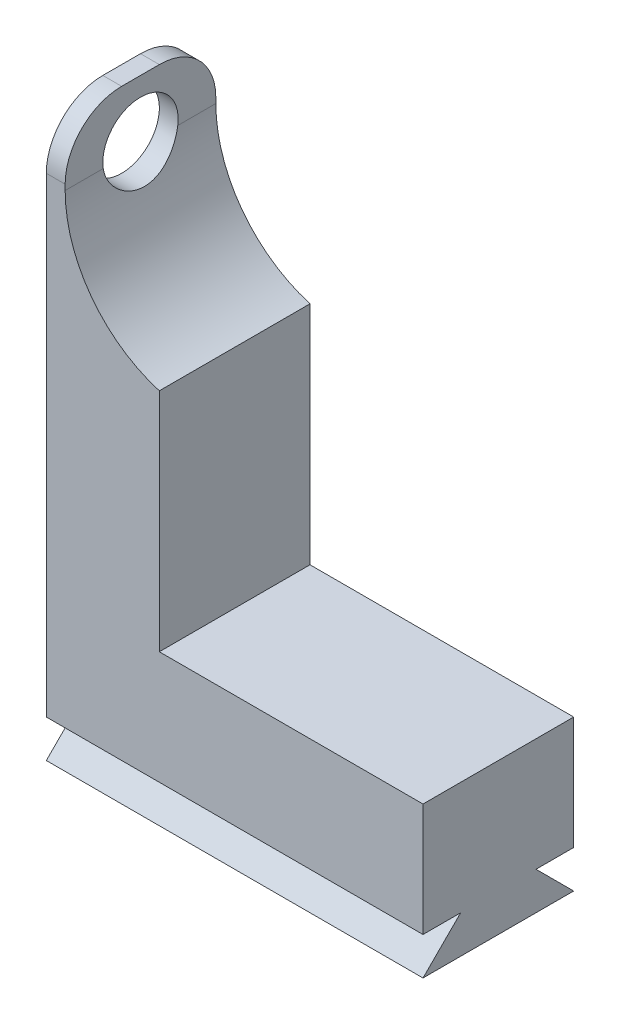
ISO-10303-21;
HEADER;
FILE_DESCRIPTION(('STEP AP214'),'2;1');
FILE_NAME('part.step','',(''),(''),'','','');
FILE_SCHEMA(('AUTOMOTIVE_DESIGN { 1 0 10303 214 1 1 1 1 }'));
ENDSEC;
DATA;
#1=APPLICATION_CONTEXT('core data for automotive mechanical design processes');
#2=APPLICATION_PROTOCOL_DEFINITION('international standard','automotive_design',2000,#1);
#3=PRODUCT_CONTEXT('',#1,'mechanical');
#4=PRODUCT('Part','Part','',(#3));
#5=PRODUCT_RELATED_PRODUCT_CATEGORY('part','',(#4));
#6=PRODUCT_DEFINITION_FORMATION('','',#4);
#7=PRODUCT_DEFINITION_CONTEXT('part definition',#1,'design');
#8=PRODUCT_DEFINITION('design','',#6,#7);
#9=PRODUCT_DEFINITION_SHAPE('','',#8);
#10=(LENGTH_UNIT() NAMED_UNIT(*) SI_UNIT(.MILLI.,.METRE.));
#11=(NAMED_UNIT(*) PLANE_ANGLE_UNIT() SI_UNIT($,.RADIAN.));
#12=(NAMED_UNIT(*) SI_UNIT($,.STERADIAN.) SOLID_ANGLE_UNIT());
#13=UNCERTAINTY_MEASURE_WITH_UNIT(LENGTH_MEASURE(1.E-05),#10,'distance_accuracy_value','');
#14=(GEOMETRIC_REPRESENTATION_CONTEXT(3) GLOBAL_UNCERTAINTY_ASSIGNED_CONTEXT((#13)) GLOBAL_UNIT_ASSIGNED_CONTEXT((#10,
#11,#12)) REPRESENTATION_CONTEXT('',''));
#15=CARTESIAN_POINT('',(0.,0.,0.));
#16=DIRECTION('',(0.,0.,1.));
#17=DIRECTION('',(1.,0.,0.));
#18=AXIS2_PLACEMENT_3D('',#15,#16,#17);
#19=CARTESIAN_POINT('',(6.,0.,0.));
#20=DIRECTION('',(-1.,0.,0.));
#21=DIRECTION('',(0.,0.,1.));
#22=AXIS2_PLACEMENT_3D('',#19,#20,#21);
#23=PLANE('',#22);
#24=DIRECTION('',(0.,0.,1.));
#25=VECTOR('',#24,1.);
#26=CARTESIAN_POINT('',(6.,-7.,-4.));
#27=LINE('',#26,#25);
#28=CARTESIAN_POINT('',(6.,-7.,-4.));
#29=VERTEX_POINT('',#28);
#30=CARTESIAN_POINT('',(6.,-7.,4.));
#31=VERTEX_POINT('',#30);
#32=EDGE_CURVE('E176',#29,#31,#27,.T.);
#33=ORIENTED_EDGE('',*,*,#32,.F.);
#34=DIRECTION('',(0.,1.,0.));
#35=VECTOR('',#34,1.);
#36=CARTESIAN_POINT('',(6.,-15.,-4.));
#37=LINE('',#36,#35);
#38=CARTESIAN_POINT('',(6.,5.,-4.));
#39=VERTEX_POINT('',#38);
#40=EDGE_CURVE('E200',#29,#39,#37,.T.);
#41=ORIENTED_EDGE('',*,*,#40,.T.);
#42=DIRECTION('',(0.,0.,-1.));
#43=VECTOR('',#42,1.);
#44=CARTESIAN_POINT('',(6.,5.,-4.));
#45=LINE('',#44,#43);
#46=CARTESIAN_POINT('',(6.,5.,4.));
#47=VERTEX_POINT('',#46);
#48=EDGE_CURVE('E188',#47,#39,#45,.T.);
#49=ORIENTED_EDGE('',*,*,#48,.F.);
#50=DIRECTION('',(0.,-1.,0.));
#51=VECTOR('',#50,1.);
#52=CARTESIAN_POINT('',(6.,-15.,4.));
#53=LINE('',#52,#51);
#54=EDGE_CURVE('E202',#47,#31,#53,.T.);
#55=ORIENTED_EDGE('',*,*,#54,.T.);
#56=EDGE_LOOP('',(#33,#41,#49,#55));
#57=FACE_BOUND('',#56,.T.);
#58=ADVANCED_FACE('F36',(#57),#23,.F.);
#59=CARTESIAN_POINT('',(6.,-15.,-4.));
#60=DIRECTION('',(0.,0.,1.));
#61=DIRECTION('',(1.,0.,0.));
#62=AXIS2_PLACEMENT_3D('',#59,#60,#61);
#63=PLANE('',#62);
#64=DIRECTION('',(0.,1.,0.));
#65=VECTOR('',#64,1.);
#66=CARTESIAN_POINT('',(20.,-15.,-4.));
#67=LINE('',#66,#65);
#68=CARTESIAN_POINT('',(20.,-13.,-4.));
#69=VERTEX_POINT('',#68);
#70=CARTESIAN_POINT('',(20.,-7.,-4.));
#71=VERTEX_POINT('',#70);
#72=EDGE_CURVE('E178',#69,#71,#67,.T.);
#73=ORIENTED_EDGE('',*,*,#72,.F.);
#74=DIRECTION('',(-1.,0.,0.));
#75=VECTOR('',#74,1.);
#76=CARTESIAN_POINT('',(20.001,-13.,-4.));
#77=LINE('',#76,#75);
#78=CARTESIAN_POINT('',(0.,-13.,-4.));
#79=VERTEX_POINT('',#78);
#80=EDGE_CURVE('E60',#69,#79,#77,.T.);
#81=ORIENTED_EDGE('',*,*,#80,.T.);
#82=DIRECTION('',(0.,1.,0.));
#83=VECTOR('',#82,1.);
#84=CARTESIAN_POINT('',(0.,-15.,-4.));
#85=LINE('',#84,#83);
#86=CARTESIAN_POINT('',(0.,12.,-4.));
#87=VERTEX_POINT('',#86);
#88=EDGE_CURVE('E197',#79,#87,#85,.T.);
#89=ORIENTED_EDGE('',*,*,#88,.T.);
#90=DIRECTION('',(-1.,0.,0.));
#91=VECTOR('',#90,1.);
#92=CARTESIAN_POINT('',(6.,12.,-4.));
#93=LINE('',#92,#91);
#94=CARTESIAN_POINT('',(1.,12.,-4.));
#95=VERTEX_POINT('',#94);
#96=EDGE_CURVE('E223',#87,#95,#93,.F.);
#97=ORIENTED_EDGE('',*,*,#96,.T.);
#98=DIRECTION('',(0.,1.,0.));
#99=VECTOR('',#98,1.);
#100=CARTESIAN_POINT('',(1.,15.,-4.));
#101=LINE('',#100,#99);
#102=CARTESIAN_POINT('',(1.,11.7082039324994,-4.));
#103=VERTEX_POINT('',#102);
#104=EDGE_CURVE('E189',#103,#95,#101,.T.);
#105=ORIENTED_EDGE('',*,*,#104,.F.);
#106=CARTESIAN_POINT('',(8.,11.7082039324994,-4.));
#107=DIRECTION('',(0.,0.,1.));
#108=DIRECTION('',(1.,0.,0.));
#109=AXIS2_PLACEMENT_3D('',#106,#107,#108);
#110=CIRCLE('',#109,7.);
#111=EDGE_CURVE('E45',#103,#39,#110,.T.);
#112=ORIENTED_EDGE('',*,*,#111,.T.);
#113=ORIENTED_EDGE('',*,*,#40,.F.);
#114=DIRECTION('',(-1.,0.,0.));
#115=VECTOR('',#114,1.);
#116=CARTESIAN_POINT('',(20.,-7.,-4.));
#117=LINE('',#116,#115);
#118=EDGE_CURVE('E170',#71,#29,#117,.T.);
#119=ORIENTED_EDGE('',*,*,#118,.F.);
#120=EDGE_LOOP('',(#73,#81,#89,#97,#105,#112,#113,#119));
#121=FACE_BOUND('',#120,.T.);
#122=ADVANCED_FACE('F260',(#121),#63,.F.);
#123=CARTESIAN_POINT('',(6.,15.,4.));
#124=DIRECTION('',(0.,-1.,0.));
#125=DIRECTION('',(0.,0.,-1.));
#126=AXIS2_PLACEMENT_3D('',#123,#124,#125);
#127=PLANE('',#126);
#128=DIRECTION('',(0.,0.,1.));
#129=VECTOR('',#128,1.);
#130=CARTESIAN_POINT('',(1.,15.,-4.));
#131=LINE('',#130,#129);
#132=CARTESIAN_POINT('',(1.,15.,-0.999999999999997));
#133=VERTEX_POINT('',#132);
#134=CARTESIAN_POINT('',(1.,15.,1.));
#135=VERTEX_POINT('',#134);
#136=EDGE_CURVE('E191',#133,#135,#131,.T.);
#137=ORIENTED_EDGE('',*,*,#136,.F.);
#138=DIRECTION('',(-1.,0.,0.));
#139=VECTOR('',#138,1.);
#140=CARTESIAN_POINT('',(6.,15.,-0.999999999999997));
#141=LINE('',#140,#139);
#142=CARTESIAN_POINT('',(0.,15.,-0.999999999999997));
#143=VERTEX_POINT('',#142);
#144=EDGE_CURVE('E215',#133,#143,#141,.T.);
#145=ORIENTED_EDGE('',*,*,#144,.T.);
#146=DIRECTION('',(0.,0.,1.));
#147=VECTOR('',#146,1.);
#148=CARTESIAN_POINT('',(0.,15.,4.));
#149=LINE('',#148,#147);
#150=CARTESIAN_POINT('',(0.,15.,1.));
#151=VERTEX_POINT('',#150);
#152=EDGE_CURVE('E206',#143,#151,#149,.T.);
#153=ORIENTED_EDGE('',*,*,#152,.T.);
#154=DIRECTION('',(-1.,0.,0.));
#155=VECTOR('',#154,1.);
#156=CARTESIAN_POINT('',(6.,15.,1.));
#157=LINE('',#156,#155);
#158=EDGE_CURVE('E153',#151,#135,#157,.F.);
#159=ORIENTED_EDGE('',*,*,#158,.T.);
#160=EDGE_LOOP('',(#137,#145,#153,#159));
#161=FACE_BOUND('',#160,.T.);
#162=ADVANCED_FACE('F270',(#161),#127,.F.);
#163=CARTESIAN_POINT('',(6.,-15.,4.));
#164=DIRECTION('',(0.,0.,-1.));
#165=DIRECTION('',(-1.,0.,0.));
#166=AXIS2_PLACEMENT_3D('',#163,#164,#165);
#167=PLANE('',#166);
#168=DIRECTION('',(0.,-1.,0.));
#169=VECTOR('',#168,1.);
#170=CARTESIAN_POINT('',(0.,-15.,4.));
#171=LINE('',#170,#169);
#172=CARTESIAN_POINT('',(0.,12.,4.));
#173=VERTEX_POINT('',#172);
#174=CARTESIAN_POINT('',(0.,-13.,4.));
#175=VERTEX_POINT('',#174);
#176=EDGE_CURVE('E209',#173,#175,#171,.T.);
#177=ORIENTED_EDGE('',*,*,#176,.T.);
#178=DIRECTION('',(-1.,0.,0.));
#179=VECTOR('',#178,1.);
#180=CARTESIAN_POINT('',(20.001,-13.,4.));
#181=LINE('',#180,#179);
#182=CARTESIAN_POINT('',(20.,-13.,4.));
#183=VERTEX_POINT('',#182);
#184=EDGE_CURVE('E316',#183,#175,#181,.T.);
#185=ORIENTED_EDGE('',*,*,#184,.F.);
#186=DIRECTION('',(0.,-1.,0.));
#187=VECTOR('',#186,1.);
#188=CARTESIAN_POINT('',(20.,-15.,4.));
#189=LINE('',#188,#187);
#190=CARTESIAN_POINT('',(20.,-7.,4.));
#191=VERTEX_POINT('',#190);
#192=EDGE_CURVE('E167',#191,#183,#189,.T.);
#193=ORIENTED_EDGE('',*,*,#192,.F.);
#194=DIRECTION('',(-1.,0.,0.));
#195=VECTOR('',#194,1.);
#196=CARTESIAN_POINT('',(20.,-7.,4.));
#197=LINE('',#196,#195);
#198=EDGE_CURVE('E166',#191,#31,#197,.T.);
#199=ORIENTED_EDGE('',*,*,#198,.T.);
#200=ORIENTED_EDGE('',*,*,#54,.F.);
#201=CARTESIAN_POINT('',(8.,11.7082039324994,4.));
#202=DIRECTION('',(0.,0.,-1.));
#203=DIRECTION('',(-1.,0.,0.));
#204=AXIS2_PLACEMENT_3D('',#201,#202,#203);
#205=CIRCLE('',#204,7.);
#206=CARTESIAN_POINT('',(1.,11.7082039324994,4.));
#207=VERTEX_POINT('',#206);
#208=EDGE_CURVE('E11',#47,#207,#205,.T.);
#209=ORIENTED_EDGE('',*,*,#208,.T.);
#210=DIRECTION('',(0.,-1.,0.));
#211=VECTOR('',#210,1.);
#212=CARTESIAN_POINT('',(1.,15.,4.));
#213=LINE('',#212,#211);
#214=CARTESIAN_POINT('',(1.,12.,4.));
#215=VERTEX_POINT('',#214);
#216=EDGE_CURVE('E194',#215,#207,#213,.T.);
#217=ORIENTED_EDGE('',*,*,#216,.F.);
#218=DIRECTION('',(-1.,0.,0.));
#219=VECTOR('',#218,1.);
#220=CARTESIAN_POINT('',(6.,12.,4.));
#221=LINE('',#220,#219);
#222=EDGE_CURVE('E230',#215,#173,#221,.T.);
#223=ORIENTED_EDGE('',*,*,#222,.T.);
#224=EDGE_LOOP('',(#177,#185,#193,#199,#200,#209,#217,#223));
#225=FACE_BOUND('',#224,.T.);
#226=ADVANCED_FACE('F267',(#225),#167,.F.);
#227=CARTESIAN_POINT('',(6.,-15.,4.));
#228=DIRECTION('',(0.,1.,0.));
#229=DIRECTION('',(0.,0.,1.));
#230=AXIS2_PLACEMENT_3D('',#227,#228,#229);
#231=PLANE('',#230);
#232=DIRECTION('',(0.,0.,-1.));
#233=VECTOR('',#232,1.);
#234=CARTESIAN_POINT('',(0.,-15.,4.));
#235=LINE('',#234,#233);
#236=CARTESIAN_POINT('',(0.,-15.,4.));
#237=VERTEX_POINT('',#236);
#238=CARTESIAN_POINT('',(0.,-15.,-4.));
#239=VERTEX_POINT('',#238);
#240=EDGE_CURVE('E203',#237,#239,#235,.T.);
#241=ORIENTED_EDGE('',*,*,#240,.T.);
#242=DIRECTION('',(-1.,0.,0.));
#243=VECTOR('',#242,1.);
#244=CARTESIAN_POINT('',(6.,-15.,-4.));
#245=LINE('',#244,#243);
#246=CARTESIAN_POINT('',(20.,-15.,-4.));
#247=VERTEX_POINT('',#246);
#248=EDGE_CURVE('E154',#247,#239,#245,.T.);
#249=ORIENTED_EDGE('',*,*,#248,.F.);
#250=DIRECTION('',(0.,0.,-1.));
#251=VECTOR('',#250,1.);
#252=CARTESIAN_POINT('',(20.,-15.,-4.));
#253=LINE('',#252,#251);
#254=CARTESIAN_POINT('',(20.,-15.,4.));
#255=VERTEX_POINT('',#254);
#256=EDGE_CURVE('E160',#255,#247,#253,.T.);
#257=ORIENTED_EDGE('',*,*,#256,.F.);
#258=DIRECTION('',(-1.,0.,0.));
#259=VECTOR('',#258,1.);
#260=CARTESIAN_POINT('',(6.,-15.,4.));
#261=LINE('',#260,#259);
#262=EDGE_CURVE('E142',#255,#237,#261,.T.);
#263=ORIENTED_EDGE('',*,*,#262,.T.);
#264=EDGE_LOOP('',(#241,#249,#257,#263));
#265=FACE_BOUND('',#264,.T.);
#266=ADVANCED_FACE('F165',(#265),#231,.F.);
#267=CARTESIAN_POINT('',(0.,0.,0.));
#268=DIRECTION('',(-1.,0.,0.));
#269=DIRECTION('',(0.,0.,1.));
#270=AXIS2_PLACEMENT_3D('',#267,#268,#269);
#271=PLANE('',#270);
#272=DIRECTION('',(0.,-0.707106781186548,0.707106781186548));
#273=VECTOR('',#272,1.);
#274=CARTESIAN_POINT('',(0.,-13.,2.));
#275=LINE('',#274,#273);
#276=CARTESIAN_POINT('',(0.,-13.,2.));
#277=VERTEX_POINT('',#276);
#278=EDGE_CURVE('E148',#277,#237,#275,.T.);
#279=ORIENTED_EDGE('',*,*,#278,.F.);
#280=DIRECTION('',(0.,0.,-1.));
#281=VECTOR('',#280,1.);
#282=CARTESIAN_POINT('',(0.,-13.,4.));
#283=LINE('',#282,#281);
#284=EDGE_CURVE('E313',#175,#277,#283,.T.);
#285=ORIENTED_EDGE('',*,*,#284,.F.);
#286=ORIENTED_EDGE('',*,*,#176,.F.);
#287=CARTESIAN_POINT('',(0.,12.,1.));
#288=DIRECTION('',(-1.,0.,0.));
#289=DIRECTION('',(0.,0.,1.));
#290=AXIS2_PLACEMENT_3D('',#287,#288,#289);
#291=CIRCLE('',#290,3.);
#292=EDGE_CURVE('E218',#173,#151,#291,.T.);
#293=ORIENTED_EDGE('',*,*,#292,.T.);
#294=ORIENTED_EDGE('',*,*,#152,.F.);
#295=CARTESIAN_POINT('',(0.,12.,-0.999999999999997));
#296=DIRECTION('',(-1.,0.,0.));
#297=DIRECTION('',(0.,0.,1.));
#298=AXIS2_PLACEMENT_3D('',#295,#296,#297);
#299=CIRCLE('',#298,3.);
#300=EDGE_CURVE('E220',#143,#87,#299,.T.);
#301=ORIENTED_EDGE('',*,*,#300,.T.);
#302=ORIENTED_EDGE('',*,*,#88,.F.);
#303=DIRECTION('',(0.,0.,-1.));
#304=VECTOR('',#303,1.);
#305=CARTESIAN_POINT('',(0.,-13.,-4.));
#306=LINE('',#305,#304);
#307=CARTESIAN_POINT('',(0.,-13.,-2.));
#308=VERTEX_POINT('',#307);
#309=EDGE_CURVE('E327',#308,#79,#306,.T.);
#310=ORIENTED_EDGE('',*,*,#309,.F.);
#311=DIRECTION('',(0.,0.707106781186548,0.707106781186548));
#312=VECTOR('',#311,1.);
#313=CARTESIAN_POINT('',(0.,-13.,-2.));
#314=LINE('',#313,#312);
#315=EDGE_CURVE('E330',#239,#308,#314,.T.);
#316=ORIENTED_EDGE('',*,*,#315,.F.);
#317=ORIENTED_EDGE('',*,*,#240,.F.);
#318=EDGE_LOOP('',(#279,#285,#286,#293,#294,#301,#302,#310,#316,#317));
#319=FACE_BOUND('',#318,.T.);
#320=CARTESIAN_POINT('',(0.,12.,0.));
#321=DIRECTION('',(-1.,0.,0.));
#322=DIRECTION('',(0.,0.,1.));
#323=AXIS2_PLACEMENT_3D('',#320,#321,#322);
#324=CIRCLE('',#323,2.);
#325=CARTESIAN_POINT('',(0.,12.,2.));
#326=VERTEX_POINT('',#325);
#327=EDGE_CURVE('E182',#326,#326,#324,.T.);
#328=ORIENTED_EDGE('',*,*,#327,.F.);
#329=EDGE_LOOP('',(#328));
#330=FACE_BOUND('',#329,.T.);
#331=ADVANCED_FACE('F256',(#319,#330),#271,.T.);
#332=CARTESIAN_POINT('',(1.,0.,0.));
#333=DIRECTION('',(-1.,0.,0.));
#334=DIRECTION('',(0.,0.,1.));
#335=AXIS2_PLACEMENT_3D('',#332,#333,#334);
#336=PLANE('',#335);
#337=ORIENTED_EDGE('',*,*,#216,.T.);
#338=DIRECTION('',(0.,0.,-1.));
#339=VECTOR('',#338,1.);
#340=CARTESIAN_POINT('',(1.,11.7082039324994,0.));
#341=LINE('',#340,#339);
#342=CARTESIAN_POINT('',(1.,11.7082039324994,1.97859926589271));
#343=VERTEX_POINT('',#342);
#344=EDGE_CURVE('E235',#207,#343,#341,.T.);
#345=ORIENTED_EDGE('',*,*,#344,.T.);
#346=CARTESIAN_POINT('',(1.,12.,0.));
#347=DIRECTION('',(-1.,0.,0.));
#348=DIRECTION('',(0.,0.,1.));
#349=AXIS2_PLACEMENT_3D('',#346,#347,#348);
#350=CIRCLE('',#349,2.);
#351=CARTESIAN_POINT('',(1.,11.7082039324994,-1.97859926589271));
#352=VERTEX_POINT('',#351);
#353=EDGE_CURVE('E185',#352,#343,#350,.F.);
#354=ORIENTED_EDGE('',*,*,#353,.F.);
#355=DIRECTION('',(0.,0.,-1.));
#356=VECTOR('',#355,1.);
#357=CARTESIAN_POINT('',(1.,11.7082039324994,0.));
#358=LINE('',#357,#356);
#359=EDGE_CURVE('E233',#352,#103,#358,.T.);
#360=ORIENTED_EDGE('',*,*,#359,.T.);
#361=ORIENTED_EDGE('',*,*,#104,.T.);
#362=CARTESIAN_POINT('',(1.,12.,-0.999999999999997));
#363=DIRECTION('',(-1.,0.,0.));
#364=DIRECTION('',(0.,0.,1.));
#365=AXIS2_PLACEMENT_3D('',#362,#363,#364);
#366=CIRCLE('',#365,3.);
#367=EDGE_CURVE('E228',#95,#133,#366,.F.);
#368=ORIENTED_EDGE('',*,*,#367,.T.);
#369=ORIENTED_EDGE('',*,*,#136,.T.);
#370=CARTESIAN_POINT('',(1.,12.,1.));
#371=DIRECTION('',(-1.,0.,0.));
#372=DIRECTION('',(0.,0.,1.));
#373=AXIS2_PLACEMENT_3D('',#370,#371,#372);
#374=CIRCLE('',#373,3.);
#375=EDGE_CURVE('E226',#135,#215,#374,.F.);
#376=ORIENTED_EDGE('',*,*,#375,.T.);
#377=EDGE_LOOP('',(#337,#345,#354,#360,#361,#368,#369,#376));
#378=FACE_BOUND('',#377,.T.);
#379=ADVANCED_FACE('F250',(#378),#336,.F.);
#380=CARTESIAN_POINT('',(6.001,12.,0.));
#381=DIRECTION('',(-1.,0.,0.));
#382=DIRECTION('',(0.,0.,1.));
#383=AXIS2_PLACEMENT_3D('',#380,#381,#382);
#384=CYLINDRICAL_SURFACE('',#383,2.);
#385=ORIENTED_EDGE('',*,*,#327,.T.);
#386=EDGE_LOOP('',(#385));
#387=FACE_BOUND('',#386,.T.);
#388=ORIENTED_EDGE('',*,*,#353,.T.);
#389=CARTESIAN_POINT('',(1.,11.7082039324994,1.97859926589271));
#390=CARTESIAN_POINT('',(0.999996562860208,11.6534103102538,1.97051932659087));
#391=CARTESIAN_POINT('',(1.00064404270127,11.5989809996655,1.96016445126653));
#392=CARTESIAN_POINT('',(1.00315721427137,11.49120493273,1.93499130449663));
#393=CARTESIAN_POINT('',(1.00502264953323,11.4378579509127,1.92017397307266));
#394=CARTESIAN_POINT('',(1.01230680676171,11.2802425839352,1.86925021813744));
#395=CARTESIAN_POINT('',(1.0194143490975,11.1780774920176,1.8266240393413));
#396=CARTESIAN_POINT('',(1.03702704684094,10.9824747134704,1.72533764417593));
#397=CARTESIAN_POINT('',(1.0475313195301,10.8890347675325,1.66668159414998));
#398=CARTESIAN_POINT('',(1.07051537194149,10.7131591235795,1.53496264942972));
#399=CARTESIAN_POINT('',(1.08299578583143,10.6307269738072,1.46189512806379));
#400=CARTESIAN_POINT('',(1.10861741912857,10.4773357089019,1.30156361481695));
#401=CARTESIAN_POINT('',(1.1217670864165,10.406662543328,1.21402731013548));
#402=CARTESIAN_POINT('',(1.14676062553112,10.2808868048644,1.02821948254142));
#403=CARTESIAN_POINT('',(1.15860439493489,10.2257854527592,0.929947118790279));
#404=CARTESIAN_POINT('',(1.17948806740025,10.1324722060938,0.724656504967221));
#405=CARTESIAN_POINT('',(1.18851038586016,10.0943656276487,0.617588458544428));
#406=CARTESIAN_POINT('',(1.20240758381608,10.0367893877439,0.398304492566966));
#407=CARTESIAN_POINT('',(1.20728348602075,10.0173151304958,0.286089849615024));
#408=CARTESIAN_POINT('',(1.21213818189386,9.99793230877699,0.0628453308607681));
#409=CARTESIAN_POINT('',(1.21224180665944,9.99752499501717,-0.0481386847254634));
#410=CARTESIAN_POINT('',(1.20785408072726,10.0150314718204,-0.268553705349644));
#411=CARTESIAN_POINT('',(1.20336291948162,10.0329445069992,-0.377984774230044));
#412=CARTESIAN_POINT('',(1.19046580159736,10.0861760662486,-0.590919969243101));
#413=CARTESIAN_POINT('',(1.18210561885863,10.1212913496116,-0.694477918393925));
#414=CARTESIAN_POINT('',(1.162556299992,10.2077645910928,-0.894285662048947));
#415=CARTESIAN_POINT('',(1.15136677722658,10.2591247693636,-0.990534455396505));
#416=CARTESIAN_POINT('',(1.12726800273844,10.3780497571907,-1.1754321377698));
#417=CARTESIAN_POINT('',(1.11432474137647,10.445964420414,-1.26385154889354));
#418=CARTESIAN_POINT('',(1.08857868933361,10.5955484465296,-1.42823943841375));
#419=CARTESIAN_POINT('',(1.07577593952752,10.6772217044483,-1.5042043789277));
#420=CARTESIAN_POINT('',(1.05175529370202,10.8538181020398,-1.64289585425982));
#421=CARTESIAN_POINT('',(1.04057083092641,10.9489570763649,-1.70535357166439));
#422=CARTESIAN_POINT('',(1.02168130333407,11.148669330584,-1.81330736430922));
#423=CARTESIAN_POINT('',(1.01397215975283,11.253231377278,-1.85882331204387));
#424=CARTESIAN_POINT('',(1.00581287837113,11.4174018870769,-1.91419633667263));
#425=CARTESIAN_POINT('',(1.00365410487768,11.4747579839976,-1.93071995661781));
#426=CARTESIAN_POINT('',(1.00074609083548,11.5906711104765,-1.95857011123507));
#427=CARTESIAN_POINT('',(0.999994957876539,11.6492264205451,-1.96990360790725));
#428=CARTESIAN_POINT('',(1.,11.7082039324994,-1.97859926589271));
#429=B_SPLINE_CURVE_WITH_KNOTS('',3,(#389,#390,#391,#392,#393,#394,#395,#396,#397,#398,#399,
#400,#401,#402,#403,#404,#405,#406,#407,#408,#409,#410,#411,#412,#413,#414,#415,#416,#417,#418,
#419,#420,#421,#422,#423,#424,#425,#426,#427,#428),.UNSPECIFIED.,.F.,.F.,(4,2,2,2,2,2,2,2,2,2,2,
2,2,2,2,2,2,2,2,4),(0.,0.166051375892929,0.332067797305901,0.66313594191583,0.994118119905654,
1.32520673017662,1.66343964047296,2.00169905988474,2.34202648622498,2.6822699468417,
3.01360827437928,3.34493294073255,3.67243419745032,3.99998023237168,4.33516209061209,
4.67043899802242,5.01187479596643,5.35290882213419,5.53186702270183,5.71058446155445),.UNSPECIFIED.);
#430=EDGE_CURVE('E238',#343,#352,#429,.T.);
#431=ORIENTED_EDGE('',*,*,#430,.T.);
#432=EDGE_LOOP('',(#388,#431));
#433=FACE_BOUND('',#432,.T.);
#434=ADVANCED_FACE('F244',(#387,#433),#384,.F.);
#435=CARTESIAN_POINT('',(6.,12.,-0.999999999999997));
#436=DIRECTION('',(-1.,0.,0.));
#437=DIRECTION('',(0.,0.,1.));
#438=AXIS2_PLACEMENT_3D('',#435,#436,#437);
#439=CYLINDRICAL_SURFACE('',#438,3.);
#440=ORIENTED_EDGE('',*,*,#367,.F.);
#441=ORIENTED_EDGE('',*,*,#96,.F.);
#442=ORIENTED_EDGE('',*,*,#300,.F.);
#443=ORIENTED_EDGE('',*,*,#144,.F.);
#444=EDGE_LOOP('',(#440,#441,#442,#443));
#445=FACE_BOUND('',#444,.T.);
#446=ADVANCED_FACE('F249',(#445),#439,.T.);
#447=CARTESIAN_POINT('',(6.,12.,1.));
#448=DIRECTION('',(-1.,0.,0.));
#449=DIRECTION('',(0.,0.,1.));
#450=AXIS2_PLACEMENT_3D('',#447,#448,#449);
#451=CYLINDRICAL_SURFACE('',#450,3.);
#452=ORIENTED_EDGE('',*,*,#375,.F.);
#453=ORIENTED_EDGE('',*,*,#158,.F.);
#454=ORIENTED_EDGE('',*,*,#292,.F.);
#455=ORIENTED_EDGE('',*,*,#222,.F.);
#456=EDGE_LOOP('',(#452,#453,#454,#455));
#457=FACE_BOUND('',#456,.T.);
#458=ADVANCED_FACE('F279',(#457),#451,.T.);
#459=CARTESIAN_POINT('',(8.,11.7082039324994,-4.));
#460=DIRECTION('',(0.,0.,-1.));
#461=DIRECTION('',(0.,1.,0.));
#462=AXIS2_PLACEMENT_3D('',#459,#460,#461);
#463=CYLINDRICAL_SURFACE('',#462,7.);
#464=ORIENTED_EDGE('',*,*,#208,.F.);
#465=ORIENTED_EDGE('',*,*,#48,.T.);
#466=ORIENTED_EDGE('',*,*,#111,.F.);
#467=ORIENTED_EDGE('',*,*,#359,.F.);
#468=ORIENTED_EDGE('',*,*,#430,.F.);
#469=ORIENTED_EDGE('',*,*,#344,.F.);
#470=EDGE_LOOP('',(#464,#465,#466,#467,#468,#469));
#471=FACE_BOUND('',#470,.T.);
#472=ADVANCED_FACE('F38',(#471),#463,.F.);
#473=CARTESIAN_POINT('',(20.,-7.,-4.));
#474=DIRECTION('',(0.,-1.,0.));
#475=DIRECTION('',(0.,0.,-1.));
#476=AXIS2_PLACEMENT_3D('',#473,#474,#475);
#477=PLANE('',#476);
#478=ORIENTED_EDGE('',*,*,#32,.T.);
#479=ORIENTED_EDGE('',*,*,#198,.F.);
#480=DIRECTION('',(0.,0.,1.));
#481=VECTOR('',#480,1.);
#482=CARTESIAN_POINT('',(20.,-7.,-4.));
#483=LINE('',#482,#481);
#484=EDGE_CURVE('E172',#71,#191,#483,.T.);
#485=ORIENTED_EDGE('',*,*,#484,.F.);
#486=ORIENTED_EDGE('',*,*,#118,.T.);
#487=EDGE_LOOP('',(#478,#479,#485,#486));
#488=FACE_BOUND('',#487,.T.);
#489=ADVANCED_FACE('F252',(#488),#477,.F.);
#490=CARTESIAN_POINT('',(20.,0.,0.));
#491=DIRECTION('',(1.,0.,0.));
#492=DIRECTION('',(0.,0.,-1.));
#493=AXIS2_PLACEMENT_3D('',#490,#491,#492);
#494=PLANE('',#493);
#495=DIRECTION('',(0.,-0.707106781186548,0.707106781186548));
#496=VECTOR('',#495,1.);
#497=CARTESIAN_POINT('',(20.,-13.,2.));
#498=LINE('',#497,#496);
#499=CARTESIAN_POINT('',(20.,-13.,2.));
#500=VERTEX_POINT('',#499);
#501=EDGE_CURVE('E145',#500,#255,#498,.T.);
#502=ORIENTED_EDGE('',*,*,#501,.T.);
#503=ORIENTED_EDGE('',*,*,#256,.T.);
#504=DIRECTION('',(0.,0.707106781186548,0.707106781186548));
#505=VECTOR('',#504,1.);
#506=CARTESIAN_POINT('',(20.,-13.,-2.));
#507=LINE('',#506,#505);
#508=CARTESIAN_POINT('',(20.,-13.,-2.));
#509=VERTEX_POINT('',#508);
#510=EDGE_CURVE('E333',#247,#509,#507,.T.);
#511=ORIENTED_EDGE('',*,*,#510,.T.);
#512=DIRECTION('',(0.,0.,-1.));
#513=VECTOR('',#512,1.);
#514=CARTESIAN_POINT('',(20.,-13.,-4.));
#515=LINE('',#514,#513);
#516=EDGE_CURVE('E323',#509,#69,#515,.T.);
#517=ORIENTED_EDGE('',*,*,#516,.T.);
#518=ORIENTED_EDGE('',*,*,#72,.T.);
#519=ORIENTED_EDGE('',*,*,#484,.T.);
#520=ORIENTED_EDGE('',*,*,#192,.T.);
#521=DIRECTION('',(0.,0.,-1.));
#522=VECTOR('',#521,1.);
#523=CARTESIAN_POINT('',(20.,-13.,4.));
#524=LINE('',#523,#522);
#525=EDGE_CURVE('E162',#183,#500,#524,.T.);
#526=ORIENTED_EDGE('',*,*,#525,.T.);
#527=EDGE_LOOP('',(#502,#503,#511,#517,#518,#519,#520,#526));
#528=FACE_BOUND('',#527,.T.);
#529=ADVANCED_FACE('F158',(#528),#494,.T.);
#530=CARTESIAN_POINT('',(20.001,-13.,-2.));
#531=DIRECTION('',(0.,-0.707106781186547,0.707106781186547));
#532=DIRECTION('',(0.,-0.707106781186548,-0.707106781186548));
#533=AXIS2_PLACEMENT_3D('',#530,#531,#532);
#534=PLANE('',#533);
#535=ORIENTED_EDGE('',*,*,#248,.T.);
#536=ORIENTED_EDGE('',*,*,#315,.T.);
#537=DIRECTION('',(-1.,0.,0.));
#538=VECTOR('',#537,1.);
#539=CARTESIAN_POINT('',(20.001,-13.,-2.));
#540=LINE('',#539,#538);
#541=EDGE_CURVE('E325',#509,#308,#540,.T.);
#542=ORIENTED_EDGE('',*,*,#541,.F.);
#543=ORIENTED_EDGE('',*,*,#510,.F.);
#544=EDGE_LOOP('',(#535,#536,#542,#543));
#545=FACE_BOUND('',#544,.T.);
#546=ADVANCED_FACE('F342',(#545),#534,.F.);
#547=CARTESIAN_POINT('',(20.001,-13.,-4.));
#548=DIRECTION('',(0.,1.,0.));
#549=DIRECTION('',(0.,0.,1.));
#550=AXIS2_PLACEMENT_3D('',#547,#548,#549);
#551=PLANE('',#550);
#552=ORIENTED_EDGE('',*,*,#541,.T.);
#553=ORIENTED_EDGE('',*,*,#309,.T.);
#554=ORIENTED_EDGE('',*,*,#80,.F.);
#555=ORIENTED_EDGE('',*,*,#516,.F.);
#556=EDGE_LOOP('',(#552,#553,#554,#555));
#557=FACE_BOUND('',#556,.T.);
#558=ADVANCED_FACE('F343',(#557),#551,.F.);
#559=CARTESIAN_POINT('',(20.001,-13.,2.));
#560=DIRECTION('',(0.,-0.707106781186547,-0.707106781186547));
#561=DIRECTION('',(0.,0.707106781186548,-0.707106781186548));
#562=AXIS2_PLACEMENT_3D('',#559,#560,#561);
#563=PLANE('',#562);
#564=DIRECTION('',(-1.,0.,0.));
#565=VECTOR('',#564,1.);
#566=CARTESIAN_POINT('',(20.001,-13.,2.));
#567=LINE('',#566,#565);
#568=EDGE_CURVE('E52',#500,#277,#567,.T.);
#569=ORIENTED_EDGE('',*,*,#568,.T.);
#570=ORIENTED_EDGE('',*,*,#278,.T.);
#571=ORIENTED_EDGE('',*,*,#262,.F.);
#572=ORIENTED_EDGE('',*,*,#501,.F.);
#573=EDGE_LOOP('',(#569,#570,#571,#572));
#574=FACE_BOUND('',#573,.T.);
#575=ADVANCED_FACE('F144',(#574),#563,.F.);
#576=CARTESIAN_POINT('',(20.001,-13.,4.));
#577=DIRECTION('',(0.,1.,0.));
#578=DIRECTION('',(0.,0.,1.));
#579=AXIS2_PLACEMENT_3D('',#576,#577,#578);
#580=PLANE('',#579);
#581=ORIENTED_EDGE('',*,*,#184,.T.);
#582=ORIENTED_EDGE('',*,*,#284,.T.);
#583=ORIENTED_EDGE('',*,*,#568,.F.);
#584=ORIENTED_EDGE('',*,*,#525,.F.);
#585=EDGE_LOOP('',(#581,#582,#583,#584));
#586=FACE_BOUND('',#585,.T.);
#587=ADVANCED_FACE('F338',(#586),#580,.F.);
#588=CLOSED_SHELL('',(#58,#122,#162,#226,#266,#331,#379,#434,#446,#458,#472,#489,#529,#546,#558,
#575,#587));
#589=MANIFOLD_SOLID_BREP('B2',#588);
#590=ADVANCED_BREP_SHAPE_REPRESENTATION('',(#18,#589),#14);
#591=SHAPE_DEFINITION_REPRESENTATION(#9,#590);
ENDSEC;
END-ISO-10303-21;
